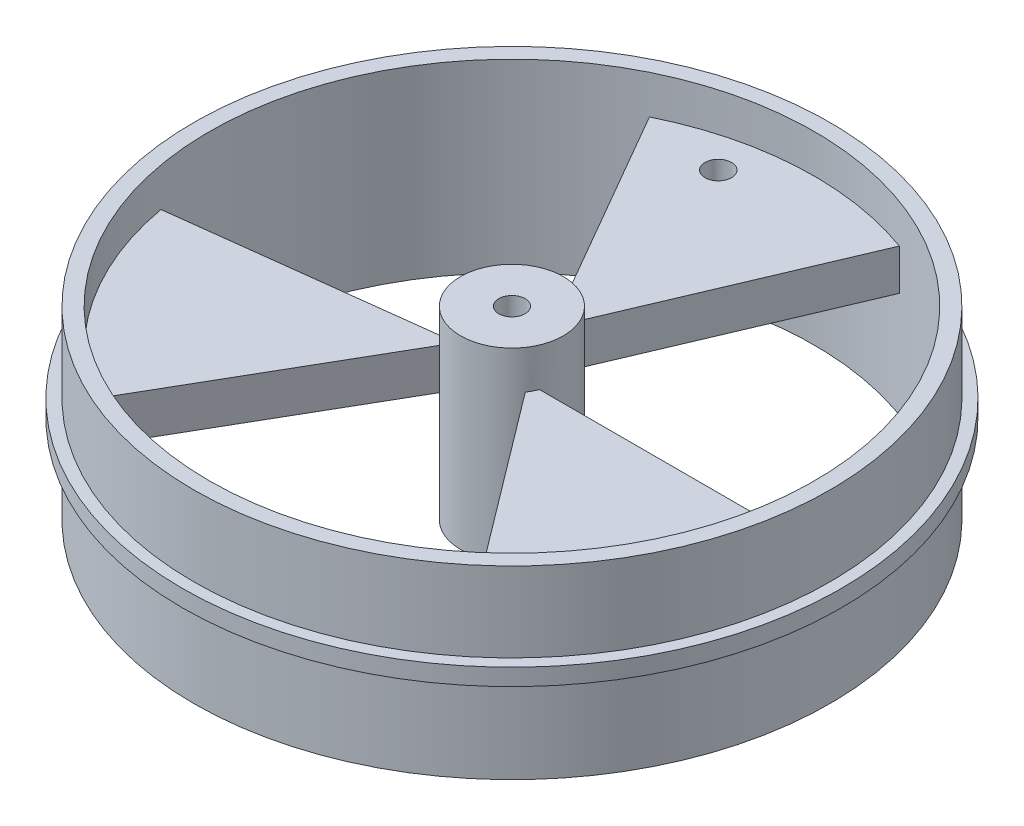
ISO-10303-21;
HEADER;
FILE_DESCRIPTION(('STEP AP214'),'2;1');
FILE_NAME('part.step','',(''),(''),'','','');
FILE_SCHEMA(('AUTOMOTIVE_DESIGN { 1 0 10303 214 1 1 1 1 }'));
ENDSEC;
DATA;
#1=APPLICATION_CONTEXT('core data for automotive mechanical design processes');
#2=APPLICATION_PROTOCOL_DEFINITION('international standard','automotive_design',2000,#1);
#3=PRODUCT_CONTEXT('',#1,'mechanical');
#4=PRODUCT('Part','Part','',(#3));
#5=PRODUCT_RELATED_PRODUCT_CATEGORY('part','',(#4));
#6=PRODUCT_DEFINITION_FORMATION('','',#4);
#7=PRODUCT_DEFINITION_CONTEXT('part definition',#1,'design');
#8=PRODUCT_DEFINITION('design','',#6,#7);
#9=PRODUCT_DEFINITION_SHAPE('','',#8);
#10=(LENGTH_UNIT() NAMED_UNIT(*) SI_UNIT(.MILLI.,.METRE.));
#11=(NAMED_UNIT(*) PLANE_ANGLE_UNIT() SI_UNIT($,.RADIAN.));
#12=(NAMED_UNIT(*) SI_UNIT($,.STERADIAN.) SOLID_ANGLE_UNIT());
#13=UNCERTAINTY_MEASURE_WITH_UNIT(LENGTH_MEASURE(1.E-05),#10,'distance_accuracy_value','');
#14=(GEOMETRIC_REPRESENTATION_CONTEXT(3) GLOBAL_UNCERTAINTY_ASSIGNED_CONTEXT((#13)) GLOBAL_UNIT_ASSIGNED_CONTEXT((#10,
#11,#12)) REPRESENTATION_CONTEXT('',''));
#15=CARTESIAN_POINT('',(0.,0.,0.));
#16=DIRECTION('',(0.,0.,1.));
#17=DIRECTION('',(1.,0.,0.));
#18=AXIS2_PLACEMENT_3D('',#15,#16,#17);
#19=CARTESIAN_POINT('',(0.,6.57965987243205,0.));
#20=DIRECTION('',(0.,1.,0.));
#21=DIRECTION('',(0.,0.,1.));
#22=AXIS2_PLACEMENT_3D('',#19,#20,#21);
#23=CYLINDRICAL_SURFACE('',#22,14.49);
#24=DIRECTION('',(0.,1.,0.));
#25=VECTOR('',#24,1.);
#26=CARTESIAN_POINT('',(4.93043286261788,6.57965987243205,-13.6253782254739));
#27=LINE('',#26,#25);
#28=CARTESIAN_POINT('',(4.93043286261788,0.,-13.6253782254739));
#29=VERTEX_POINT('',#28);
#30=CARTESIAN_POINT('',(4.93043286261788,1.96148714375324,-13.6253782254739));
#31=VERTEX_POINT('',#30);
#32=EDGE_CURVE('E184',#29,#31,#27,.T.);
#33=ORIENTED_EDGE('',*,*,#32,.F.);
#34=CARTESIAN_POINT('',(0.,0.,0.));
#35=DIRECTION('',(0.,1.,0.));
#36=DIRECTION('',(0.,0.,1.));
#37=AXIS2_PLACEMENT_3D('',#34,#35,#36);
#38=CIRCLE('',#37,14.49);
#39=CARTESIAN_POINT('',(-6.41011764680214,0.,-12.9950179589778));
#40=VERTEX_POINT('',#39);
#41=EDGE_CURVE('E191',#40,#29,#38,.F.);
#42=ORIENTED_EDGE('',*,*,#41,.F.);
#43=DIRECTION('',(0.,1.,0.));
#44=VECTOR('',#43,1.);
#45=CARTESIAN_POINT('',(-6.41011764680214,6.57965987243205,-12.9950179589778));
#46=LINE('',#45,#44);
#47=CARTESIAN_POINT('',(-6.41011764680214,1.96148714375324,-12.9950179589778));
#48=VERTEX_POINT('',#47);
#49=EDGE_CURVE('E180',#40,#48,#46,.T.);
#50=ORIENTED_EDGE('',*,*,#49,.T.);
#51=CARTESIAN_POINT('',(0.,1.96148714375324,0.));
#52=DIRECTION('',(0.,-1.,0.));
#53=DIRECTION('',(0.,0.,-1.));
#54=AXIS2_PLACEMENT_3D('',#51,#52,#53);
#55=CIRCLE('',#54,14.49);
#56=EDGE_CURVE('E187',#31,#48,#55,.F.);
#57=ORIENTED_EDGE('',*,*,#56,.F.);
#58=EDGE_LOOP('',(#33,#42,#50,#57));
#59=FACE_BOUND('',#58,.T.);
#60=CARTESIAN_POINT('',(0.,3.81388504044521,0.));
#61=DIRECTION('',(0.,1.,0.));
#62=DIRECTION('',(0.,0.,1.));
#63=AXIS2_PLACEMENT_3D('',#60,#61,#62);
#64=CIRCLE('',#63,14.49);
#65=CARTESIAN_POINT('',(0.,3.81388504044521,14.49));
#66=VERTEX_POINT('',#65);
#67=EDGE_CURVE('E272',#66,#66,#64,.T.);
#68=ORIENTED_EDGE('',*,*,#67,.T.);
#69=EDGE_LOOP('',(#68));
#70=FACE_BOUND('',#69,.T.);
#71=CARTESIAN_POINT('',(0.,-5.04947785274883,0.));
#72=DIRECTION('',(0.,1.,0.));
#73=DIRECTION('',(0.,0.,1.));
#74=AXIS2_PLACEMENT_3D('',#71,#72,#73);
#75=CIRCLE('',#74,14.49);
#76=CARTESIAN_POINT('',(0.,-5.04947785274883,14.49));
#77=VERTEX_POINT('',#76);
#78=EDGE_CURVE('E276',#77,#77,#75,.T.);
#79=ORIENTED_EDGE('',*,*,#78,.F.);
#80=EDGE_LOOP('',(#79));
#81=FACE_BOUND('',#80,.T.);
#82=CARTESIAN_POINT('',(0.,0.,0.));
#83=DIRECTION('',(0.,1.,0.));
#84=DIRECTION('',(0.,0.,1.));
#85=AXIS2_PLACEMENT_3D('',#82,#83,#84);
#86=CIRCLE('',#85,14.49);
#87=CARTESIAN_POINT('',(14.49,0.,0.));
#88=VERTEX_POINT('',#87);
#89=CARTESIAN_POINT('',(9.33470724812272,0.,11.0825692234177));
#90=VERTEX_POINT('',#89);
#91=EDGE_CURVE('E288',#88,#90,#86,.F.);
#92=ORIENTED_EDGE('',*,*,#91,.F.);
#93=CARTESIAN_POINT('',(0.,0.,0.));
#94=DIRECTION('',(0.,0.434473259704055,-0.900684732080062));
#95=DIRECTION('',(0.,0.900684732080062,0.434473259704055));
#96=AXIS2_PLACEMENT_3D('',#93,#94,#95);
#97=ELLIPSE('',#96,33.3507291331807,14.49);
#98=CARTESIAN_POINT('',(14.4590744985109,1.96148714375324,0.946184256111396));
#99=VERTEX_POINT('',#98);
#100=EDGE_CURVE('E229',#88,#99,#97,.F.);
#101=ORIENTED_EDGE('',*,*,#100,.T.);
#102=CARTESIAN_POINT('',(0.,1.96148714375324,0.));
#103=DIRECTION('',(0.,-1.,0.));
#104=DIRECTION('',(0.,0.,-1.));
#105=AXIS2_PLACEMENT_3D('',#102,#103,#104);
#106=CIRCLE('',#105,14.49);
#107=CARTESIAN_POINT('',(9.33470724812272,1.96148714375324,11.0825692234177));
#108=VERTEX_POINT('',#107);
#109=EDGE_CURVE('E284',#108,#99,#106,.F.);
#110=ORIENTED_EDGE('',*,*,#109,.F.);
#111=DIRECTION('',(0.,1.,0.));
#112=VECTOR('',#111,1.);
#113=CARTESIAN_POINT('',(9.33470724812272,6.57965987243205,11.0825692234177));
#114=LINE('',#113,#112);
#115=EDGE_CURVE('E292',#90,#108,#114,.T.);
#116=ORIENTED_EDGE('',*,*,#115,.F.);
#117=EDGE_LOOP('',(#92,#101,#110,#116));
#118=FACE_BOUND('',#117,.T.);
#119=DIRECTION('',(0.,1.,0.));
#120=VECTOR('',#119,1.);
#121=CARTESIAN_POINT('',(-14.2651401107406,6.57965987243205,2.54280900205629));
#122=LINE('',#121,#120);
#123=CARTESIAN_POINT('',(-14.2651401107406,0.,2.54280900205629));
#124=VERTEX_POINT('',#123);
#125=CARTESIAN_POINT('',(-14.2651401107406,1.96148714375324,2.54280900205629));
#126=VERTEX_POINT('',#125);
#127=EDGE_CURVE('E145',#124,#126,#122,.T.);
#128=ORIENTED_EDGE('',*,*,#127,.F.);
#129=CARTESIAN_POINT('',(0.,0.,0.));
#130=DIRECTION('',(0.,1.,0.));
#131=DIRECTION('',(0.,0.,1.));
#132=AXIS2_PLACEMENT_3D('',#129,#130,#131);
#133=CIRCLE('',#132,14.49);
#134=CARTESIAN_POINT('',(-8.04895685170866,0.,12.0488337028665));
#135=VERTEX_POINT('',#134);
#136=EDGE_CURVE('E151',#135,#124,#133,.F.);
#137=ORIENTED_EDGE('',*,*,#136,.F.);
#138=DIRECTION('',(0.,1.,0.));
#139=VECTOR('',#138,1.);
#140=CARTESIAN_POINT('',(-8.04895685170866,6.57965987243205,12.0488337028665));
#141=LINE('',#140,#139);
#142=CARTESIAN_POINT('',(-8.04895685170866,1.96148714375324,12.0488337028665));
#143=VERTEX_POINT('',#142);
#144=EDGE_CURVE('E137',#135,#143,#141,.T.);
#145=ORIENTED_EDGE('',*,*,#144,.T.);
#146=CARTESIAN_POINT('',(0.,1.96148714375324,0.));
#147=DIRECTION('',(0.,-1.,0.));
#148=DIRECTION('',(0.,0.,-1.));
#149=AXIS2_PLACEMENT_3D('',#146,#147,#148);
#150=CIRCLE('',#149,14.49);
#151=EDGE_CURVE('E159',#126,#143,#150,.F.);
#152=ORIENTED_EDGE('',*,*,#151,.F.);
#153=EDGE_LOOP('',(#128,#137,#145,#152));
#154=FACE_BOUND('',#153,.T.);
#155=ADVANCED_FACE('F49',(#59,#70,#81,#118,#154),#23,.F.);
#156=CARTESIAN_POINT('',(0.,6.57965987243205,0.));
#157=DIRECTION('',(0.,1.,0.));
#158=DIRECTION('',(0.,0.,1.));
#159=AXIS2_PLACEMENT_3D('',#156,#157,#158);
#160=CYLINDRICAL_SURFACE('',#159,2.45972344573901);
#161=CARTESIAN_POINT('',(0.,3.81388504044521,0.));
#162=DIRECTION('',(0.,1.,0.));
#163=DIRECTION('',(0.,0.,1.));
#164=AXIS2_PLACEMENT_3D('',#161,#162,#163);
#165=CIRCLE('',#164,2.45972344573901);
#166=CARTESIAN_POINT('',(0.,3.81388504044521,2.45972344573901));
#167=VERTEX_POINT('',#166);
#168=EDGE_CURVE('E209',#167,#167,#165,.T.);
#169=ORIENTED_EDGE('',*,*,#168,.F.);
#170=EDGE_LOOP('',(#169));
#171=FACE_BOUND('',#170,.T.);
#172=CARTESIAN_POINT('',(0.,-5.04947785274883,0.));
#173=DIRECTION('',(0.,1.,0.));
#174=DIRECTION('',(0.,0.,1.));
#175=AXIS2_PLACEMENT_3D('',#172,#173,#174);
#176=CIRCLE('',#175,2.45972344573901);
#177=CARTESIAN_POINT('',(0.,-5.04947785274883,2.45972344573901));
#178=VERTEX_POINT('',#177);
#179=EDGE_CURVE('E205',#178,#178,#176,.T.);
#180=ORIENTED_EDGE('',*,*,#179,.T.);
#181=EDGE_LOOP('',(#180));
#182=FACE_BOUND('',#181,.T.);
#183=CARTESIAN_POINT('',(0.,0.,0.));
#184=DIRECTION('',(0.,-1.,0.));
#185=DIRECTION('',(0.,0.,-1.));
#186=AXIS2_PLACEMENT_3D('',#183,#184,#185);
#187=CIRCLE('',#186,2.45972344573901);
#188=CARTESIAN_POINT('',(2.03003992652024,0.,1.38894828062526));
#189=VERTEX_POINT('',#188);
#190=CARTESIAN_POINT('',(2.45972344573901,0.,0.));
#191=VERTEX_POINT('',#190);
#192=EDGE_CURVE('E221',#189,#191,#187,.F.);
#193=ORIENTED_EDGE('',*,*,#192,.F.);
#194=DIRECTION('',(0.,1.,0.));
#195=VECTOR('',#194,1.);
#196=CARTESIAN_POINT('',(2.03003992652024,6.57965987243205,1.38894828062526));
#197=LINE('',#196,#195);
#198=CARTESIAN_POINT('',(2.03003992652024,1.96148714375324,1.38894828062526));
#199=VERTEX_POINT('',#198);
#200=EDGE_CURVE('E233',#199,#189,#197,.F.);
#201=ORIENTED_EDGE('',*,*,#200,.F.);
#202=CARTESIAN_POINT('',(0.,1.96148714375324,0.));
#203=DIRECTION('',(0.,-1.,0.));
#204=DIRECTION('',(0.,0.,-1.));
#205=AXIS2_PLACEMENT_3D('',#202,#203,#204);
#206=CIRCLE('',#205,2.45972344573901);
#207=CARTESIAN_POINT('',(2.27045695466906,1.96148714375324,0.946184256111396));
#208=VERTEX_POINT('',#207);
#209=EDGE_CURVE('E237',#208,#199,#206,.T.);
#210=ORIENTED_EDGE('',*,*,#209,.F.);
#211=CARTESIAN_POINT('',(0.,0.,0.));
#212=DIRECTION('',(0.,0.434473259704055,-0.900684732080062));
#213=DIRECTION('',(0.,0.900684732080062,0.434473259704055));
#214=AXIS2_PLACEMENT_3D('',#211,#212,#213);
#215=ELLIPSE('',#214,5.66139202079886,2.45972344573901);
#216=EDGE_CURVE('E225',#191,#208,#215,.F.);
#217=ORIENTED_EDGE('',*,*,#216,.F.);
#218=EDGE_LOOP('',(#193,#201,#210,#217));
#219=FACE_BOUND('',#218,.T.);
#220=CARTESIAN_POINT('',(0.,0.,0.));
#221=DIRECTION('',(0.,1.,0.));
#222=DIRECTION('',(0.,0.,1.));
#223=AXIS2_PLACEMENT_3D('',#220,#221,#222);
#224=CIRCLE('',#223,2.45972344573901);
#225=CARTESIAN_POINT('',(-0.315808874881191,0.,-2.43936552899816));
#226=VERTEX_POINT('',#225);
#227=CARTESIAN_POINT('',(0.187844532304064,0.,-2.45254028737586));
#228=VERTEX_POINT('',#227);
#229=EDGE_CURVE('E302',#226,#228,#224,.F.);
#230=ORIENTED_EDGE('',*,*,#229,.T.);
#231=DIRECTION('',(0.,1.,0.));
#232=VECTOR('',#231,1.);
#233=CARTESIAN_POINT('',(0.187844532304066,6.57965987243205,-2.45254028737586));
#234=LINE('',#233,#232);
#235=CARTESIAN_POINT('',(0.187844532304066,1.96148714375324,-2.45254028737586));
#236=VERTEX_POINT('',#235);
#237=EDGE_CURVE('E305',#228,#236,#234,.T.);
#238=ORIENTED_EDGE('',*,*,#237,.T.);
#239=CARTESIAN_POINT('',(0.,1.96148714375324,0.));
#240=DIRECTION('',(0.,-1.,0.));
#241=DIRECTION('',(0.,0.,-1.));
#242=AXIS2_PLACEMENT_3D('',#239,#240,#241);
#243=CIRCLE('',#242,2.45972344573901);
#244=CARTESIAN_POINT('',(-0.315808874881191,1.96148714375324,-2.43936552899816));
#245=VERTEX_POINT('',#244);
#246=EDGE_CURVE('E299',#236,#245,#243,.F.);
#247=ORIENTED_EDGE('',*,*,#246,.T.);
#248=DIRECTION('',(0.,1.,0.));
#249=VECTOR('',#248,1.);
#250=CARTESIAN_POINT('',(-0.315808874881191,6.57965987243205,-2.43936552899816));
#251=LINE('',#250,#249);
#252=EDGE_CURVE('E295',#226,#245,#251,.T.);
#253=ORIENTED_EDGE('',*,*,#252,.F.);
#254=EDGE_LOOP('',(#230,#238,#247,#253));
#255=FACE_BOUND('',#254,.T.);
#256=CARTESIAN_POINT('',(0.,0.,0.));
#257=DIRECTION('',(0.,1.,0.));
#258=DIRECTION('',(0.,0.,1.));
#259=AXIS2_PLACEMENT_3D('',#256,#257,#258);
#260=CIRCLE('',#259,2.45972344573901);
#261=CARTESIAN_POINT('',(-1.95464807978787,0.,1.49318127288678));
#262=VERTEX_POINT('',#261);
#263=CARTESIAN_POINT('',(-2.21788445882431,0.,1.06359200675061));
#264=VERTEX_POINT('',#263);
#265=EDGE_CURVE('E58',#262,#264,#260,.F.);
#266=ORIENTED_EDGE('',*,*,#265,.T.);
#267=DIRECTION('',(0.,1.,0.));
#268=VECTOR('',#267,1.);
#269=CARTESIAN_POINT('',(-2.21788445882431,6.57965987243205,1.06359200675061));
#270=LINE('',#269,#268);
#271=CARTESIAN_POINT('',(-2.21788445882431,1.96148714375324,1.06359200675061));
#272=VERTEX_POINT('',#271);
#273=EDGE_CURVE('E11',#264,#272,#270,.T.);
#274=ORIENTED_EDGE('',*,*,#273,.T.);
#275=CARTESIAN_POINT('',(0.,1.96148714375324,0.));
#276=DIRECTION('',(0.,-1.,0.));
#277=DIRECTION('',(0.,0.,-1.));
#278=AXIS2_PLACEMENT_3D('',#275,#276,#277);
#279=CIRCLE('',#278,2.45972344573901);
#280=CARTESIAN_POINT('',(-1.95464807978787,1.96148714375324,1.49318127288678));
#281=VERTEX_POINT('',#280);
#282=EDGE_CURVE('E311',#272,#281,#279,.F.);
#283=ORIENTED_EDGE('',*,*,#282,.T.);
#284=DIRECTION('',(0.,1.,0.));
#285=VECTOR('',#284,1.);
#286=CARTESIAN_POINT('',(-1.95464807978787,6.57965987243205,1.49318127288678));
#287=LINE('',#286,#285);
#288=EDGE_CURVE('E308',#262,#281,#287,.T.);
#289=ORIENTED_EDGE('',*,*,#288,.F.);
#290=EDGE_LOOP('',(#266,#274,#283,#289));
#291=FACE_BOUND('',#290,.T.);
#292=ADVANCED_FACE('F315',(#171,#182,#219,#255,#291),#160,.T.);
#293=CARTESIAN_POINT('',(0.,6.57965987243205,0.));
#294=DIRECTION('',(0.,1.,0.));
#295=DIRECTION('',(0.,0.,1.));
#296=AXIS2_PLACEMENT_3D('',#293,#294,#295);
#297=CYLINDRICAL_SURFACE('',#296,15.24);
#298=CARTESIAN_POINT('',(0.,-0.805733209137354,0.));
#299=DIRECTION('',(0.,1.,0.));
#300=DIRECTION('',(0.,0.,1.));
#301=AXIS2_PLACEMENT_3D('',#298,#299,#300);
#302=CIRCLE('',#301,15.24);
#303=CARTESIAN_POINT('',(0.,-0.805733209137354,15.24));
#304=VERTEX_POINT('',#303);
#305=EDGE_CURVE('E252',#304,#304,#302,.T.);
#306=ORIENTED_EDGE('',*,*,#305,.F.);
#307=EDGE_LOOP('',(#306));
#308=FACE_BOUND('',#307,.T.);
#309=CARTESIAN_POINT('',(0.,-5.04947785274883,0.));
#310=DIRECTION('',(0.,1.,0.));
#311=DIRECTION('',(0.,0.,1.));
#312=AXIS2_PLACEMENT_3D('',#309,#310,#311);
#313=CIRCLE('',#312,15.24);
#314=CARTESIAN_POINT('',(0.,-5.04947785274883,15.24));
#315=VERTEX_POINT('',#314);
#316=EDGE_CURVE('E280',#315,#315,#313,.T.);
#317=ORIENTED_EDGE('',*,*,#316,.T.);
#318=EDGE_LOOP('',(#317));
#319=FACE_BOUND('',#318,.T.);
#320=ADVANCED_FACE('F51',(#308,#319),#297,.T.);
#321=CARTESIAN_POINT('',(0.,-5.04947785274883,0.));
#322=DIRECTION('',(0.,1.,0.));
#323=DIRECTION('',(0.,0.,1.));
#324=AXIS2_PLACEMENT_3D('',#321,#322,#323);
#325=PLANE('',#324);
#326=ORIENTED_EDGE('',*,*,#316,.F.);
#327=EDGE_LOOP('',(#326));
#328=FACE_BOUND('',#327,.T.);
#329=ORIENTED_EDGE('',*,*,#78,.T.);
#330=EDGE_LOOP('',(#329));
#331=FACE_BOUND('',#330,.T.);
#332=ADVANCED_FACE('F354',(#328,#331),#325,.F.);
#333=CARTESIAN_POINT('',(0.,3.81388504044521,0.));
#334=DIRECTION('',(0.,1.,0.));
#335=DIRECTION('',(0.,0.,1.));
#336=AXIS2_PLACEMENT_3D('',#333,#334,#335);
#337=PLANE('',#336);
#338=CARTESIAN_POINT('',(0.,3.81388504044521,0.));
#339=DIRECTION('',(0.,1.,0.));
#340=DIRECTION('',(0.,0.,1.));
#341=AXIS2_PLACEMENT_3D('',#338,#339,#340);
#342=CIRCLE('',#341,15.24);
#343=CARTESIAN_POINT('',(0.,3.81388504044521,15.24));
#344=VERTEX_POINT('',#343);
#345=EDGE_CURVE('E268',#344,#344,#342,.T.);
#346=ORIENTED_EDGE('',*,*,#345,.T.);
#347=EDGE_LOOP('',(#346));
#348=FACE_BOUND('',#347,.T.);
#349=ORIENTED_EDGE('',*,*,#67,.F.);
#350=EDGE_LOOP('',(#349));
#351=FACE_BOUND('',#350,.T.);
#352=ADVANCED_FACE('F352',(#348,#351),#337,.T.);
#353=CARTESIAN_POINT('',(0.,6.57965987243205,0.));
#354=DIRECTION('',(0.,1.,0.));
#355=DIRECTION('',(0.,0.,1.));
#356=AXIS2_PLACEMENT_3D('',#353,#354,#355);
#357=CYLINDRICAL_SURFACE('',#356,15.24);
#358=CARTESIAN_POINT('',(0.,0.,0.));
#359=DIRECTION('',(0.,1.,0.));
#360=DIRECTION('',(0.,0.,1.));
#361=AXIS2_PLACEMENT_3D('',#358,#359,#360);
#362=CIRCLE('',#361,15.24);
#363=CARTESIAN_POINT('',(0.,0.,15.24));
#364=VERTEX_POINT('',#363);
#365=EDGE_CURVE('E264',#364,#364,#362,.T.);
#366=ORIENTED_EDGE('',*,*,#365,.T.);
#367=EDGE_LOOP('',(#366));
#368=FACE_BOUND('',#367,.T.);
#369=ORIENTED_EDGE('',*,*,#345,.F.);
#370=EDGE_LOOP('',(#369));
#371=FACE_BOUND('',#370,.T.);
#372=ADVANCED_FACE('F361',(#368,#371),#357,.T.);
#373=CARTESIAN_POINT('',(0.,0.,0.));
#374=DIRECTION('',(0.,1.,0.));
#375=DIRECTION('',(0.,0.,1.));
#376=AXIS2_PLACEMENT_3D('',#373,#374,#375);
#377=PLANE('',#376);
#378=CARTESIAN_POINT('',(0.,0.,0.));
#379=DIRECTION('',(0.,1.,0.));
#380=DIRECTION('',(0.,0.,1.));
#381=AXIS2_PLACEMENT_3D('',#378,#379,#380);
#382=CIRCLE('',#381,15.7847494286564);
#383=CARTESIAN_POINT('',(0.,0.,15.7847494286564));
#384=VERTEX_POINT('',#383);
#385=EDGE_CURVE('E260',#384,#384,#382,.T.);
#386=ORIENTED_EDGE('',*,*,#385,.T.);
#387=EDGE_LOOP('',(#386));
#388=FACE_BOUND('',#387,.T.);
#389=ORIENTED_EDGE('',*,*,#365,.F.);
#390=EDGE_LOOP('',(#389));
#391=FACE_BOUND('',#390,.T.);
#392=ADVANCED_FACE('F402',(#388,#391),#377,.T.);
#393=CARTESIAN_POINT('',(0.,6.57965987243205,0.));
#394=DIRECTION('',(0.,1.,0.));
#395=DIRECTION('',(0.,0.,1.));
#396=AXIS2_PLACEMENT_3D('',#393,#394,#395);
#397=CYLINDRICAL_SURFACE('',#396,15.7847494286564);
#398=CARTESIAN_POINT('',(0.,-0.805733209137354,0.));
#399=DIRECTION('',(0.,1.,0.));
#400=DIRECTION('',(0.,0.,1.));
#401=AXIS2_PLACEMENT_3D('',#398,#399,#400);
#402=CIRCLE('',#401,15.7847494286564);
#403=CARTESIAN_POINT('',(0.,-0.805733209137354,15.7847494286564));
#404=VERTEX_POINT('',#403);
#405=EDGE_CURVE('E256',#404,#404,#402,.T.);
#406=ORIENTED_EDGE('',*,*,#405,.T.);
#407=EDGE_LOOP('',(#406));
#408=FACE_BOUND('',#407,.T.);
#409=ORIENTED_EDGE('',*,*,#385,.F.);
#410=EDGE_LOOP('',(#409));
#411=FACE_BOUND('',#410,.T.);
#412=ADVANCED_FACE('F398',(#408,#411),#397,.T.);
#413=CARTESIAN_POINT('',(0.,-0.805733209137354,0.));
#414=DIRECTION('',(0.,-1.,0.));
#415=DIRECTION('',(0.,0.,-1.));
#416=AXIS2_PLACEMENT_3D('',#413,#414,#415);
#417=PLANE('',#416);
#418=ORIENTED_EDGE('',*,*,#305,.T.);
#419=EDGE_LOOP('',(#418));
#420=FACE_BOUND('',#419,.T.);
#421=ORIENTED_EDGE('',*,*,#405,.F.);
#422=EDGE_LOOP('',(#421));
#423=FACE_BOUND('',#422,.T.);
#424=ADVANCED_FACE('F393',(#420,#423),#417,.T.);
#425=CARTESIAN_POINT('',(9.59335249459646,0.,11.4258030583874));
#426=DIRECTION('',(0.,1.,0.));
#427=DIRECTION('',(0.,0.,1.));
#428=AXIS2_PLACEMENT_3D('',#425,#426,#427);
#429=PLANE('',#428);
#430=DIRECTION('',(0.601815023152047,0.,0.798635510047294));
#431=VECTOR('',#430,1.);
#432=CARTESIAN_POINT('',(9.59335249459646,0.,11.4258030583874));
#433=LINE('',#432,#431);
#434=EDGE_CURVE('E245',#189,#90,#433,.T.);
#435=ORIENTED_EDGE('',*,*,#434,.F.);
#436=ORIENTED_EDGE('',*,*,#192,.T.);
#437=DIRECTION('',(-1.,0.,0.));
#438=VECTOR('',#437,1.);
#439=CARTESIAN_POINT('',(14.6049,0.,0.));
#440=LINE('',#439,#438);
#441=EDGE_CURVE('E194',#88,#191,#440,.T.);
#442=ORIENTED_EDGE('',*,*,#441,.F.);
#443=ORIENTED_EDGE('',*,*,#91,.T.);
#444=EDGE_LOOP('',(#435,#436,#442,#443));
#445=FACE_BOUND('',#444,.T.);
#446=ADVANCED_FACE('F378',(#445),#429,.F.);
#447=CARTESIAN_POINT('',(1.696393302608,1.96148714375324,0.946184256111396));
#448=DIRECTION('',(0.,-1.,0.));
#449=DIRECTION('',(0.,0.,-1.));
#450=AXIS2_PLACEMENT_3D('',#447,#448,#449);
#451=PLANE('',#450);
#452=DIRECTION('',(-1.,0.,0.));
#453=VECTOR('',#452,1.);
#454=CARTESIAN_POINT('',(1.696393302608,1.96148714375324,0.946184256111396));
#455=LINE('',#454,#453);
#456=EDGE_CURVE('E241',#99,#208,#455,.T.);
#457=ORIENTED_EDGE('',*,*,#456,.T.);
#458=ORIENTED_EDGE('',*,*,#209,.T.);
#459=DIRECTION('',(-0.601815023152047,0.,-0.798635510047294));
#460=VECTOR('',#459,1.);
#461=CARTESIAN_POINT('',(1.696393302608,1.96148714375324,0.946184256111396));
#462=LINE('',#461,#460);
#463=EDGE_CURVE('E248',#108,#199,#462,.T.);
#464=ORIENTED_EDGE('',*,*,#463,.F.);
#465=ORIENTED_EDGE('',*,*,#109,.T.);
#466=EDGE_LOOP('',(#457,#458,#464,#465));
#467=FACE_BOUND('',#466,.T.);
#468=ADVANCED_FACE('F385',(#467),#451,.F.);
#469=CARTESIAN_POINT('',(0.675478327923989,0.,-0.408615674357758));
#470=DIRECTION('',(0.798635510047294,0.,-0.601815023152047));
#471=DIRECTION('',(-0.601815023152047,0.,-0.798635510047294));
#472=AXIS2_PLACEMENT_3D('',#469,#470,#471);
#473=PLANE('',#472);
#474=ORIENTED_EDGE('',*,*,#463,.T.);
#475=ORIENTED_EDGE('',*,*,#200,.T.);
#476=ORIENTED_EDGE('',*,*,#434,.T.);
#477=ORIENTED_EDGE('',*,*,#115,.T.);
#478=EDGE_LOOP('',(#474,#475,#476,#477));
#479=FACE_BOUND('',#478,.T.);
#480=ADVANCED_FACE('F382',(#479),#473,.F.);
#481=CARTESIAN_POINT('',(14.6049,0.,0.));
#482=DIRECTION('',(0.,0.434473259704055,-0.900684732080062));
#483=DIRECTION('',(0.,0.900684732080062,0.434473259704055));
#484=AXIS2_PLACEMENT_3D('',#481,#482,#483);
#485=PLANE('',#484);
#486=ORIENTED_EDGE('',*,*,#100,.F.);
#487=ORIENTED_EDGE('',*,*,#441,.T.);
#488=ORIENTED_EDGE('',*,*,#216,.T.);
#489=ORIENTED_EDGE('',*,*,#456,.F.);
#490=EDGE_LOOP('',(#486,#487,#488,#489));
#491=FACE_BOUND('',#490,.T.);
#492=ADVANCED_FACE('F376',(#491),#485,.T.);
#493=CARTESIAN_POINT('',(0.,2.81765826799531,0.));
#494=DIRECTION('',(0.,1.,0.));
#495=DIRECTION('',(0.,0.,1.));
#496=AXIS2_PLACEMENT_3D('',#493,#494,#495);
#497=PLANE('',#496);
#498=CARTESIAN_POINT('',(0.,2.81765826799531,0.));
#499=DIRECTION('',(0.,1.,0.));
#500=DIRECTION('',(0.,0.,1.));
#501=AXIS2_PLACEMENT_3D('',#498,#499,#500);
#502=CIRCLE('',#501,1.66187698324019);
#503=CARTESIAN_POINT('',(0.,2.81765826799531,1.66187698324019));
#504=VERTEX_POINT('',#503);
#505=EDGE_CURVE('E197',#504,#504,#502,.T.);
#506=ORIENTED_EDGE('',*,*,#505,.F.);
#507=EDGE_LOOP('',(#506));
#508=FACE_BOUND('',#507,.T.);
#509=CARTESIAN_POINT('',(0.,2.81765826799531,0.));
#510=DIRECTION('',(0.,1.,0.));
#511=DIRECTION('',(0.,0.,1.));
#512=AXIS2_PLACEMENT_3D('',#509,#510,#511);
#513=CIRCLE('',#512,0.629369796477006);
#514=CARTESIAN_POINT('',(0.,2.81765826799531,0.629369796477006));
#515=VERTEX_POINT('',#514);
#516=EDGE_CURVE('E217',#515,#515,#513,.T.);
#517=ORIENTED_EDGE('',*,*,#516,.T.);
#518=EDGE_LOOP('',(#517));
#519=FACE_BOUND('',#518,.T.);
#520=ADVANCED_FACE('F523',(#508,#519),#497,.F.);
#521=CARTESIAN_POINT('',(0.,6.57965987243205,0.));
#522=DIRECTION('',(0.,1.,0.));
#523=DIRECTION('',(0.,0.,1.));
#524=AXIS2_PLACEMENT_3D('',#521,#522,#523);
#525=CYLINDRICAL_SURFACE('',#524,0.629369796477006);
#526=ORIENTED_EDGE('',*,*,#516,.F.);
#527=EDGE_LOOP('',(#526));
#528=FACE_BOUND('',#527,.T.);
#529=CARTESIAN_POINT('',(0.,3.81388504044521,0.));
#530=DIRECTION('',(0.,1.,0.));
#531=DIRECTION('',(0.,0.,1.));
#532=AXIS2_PLACEMENT_3D('',#529,#530,#531);
#533=CIRCLE('',#532,0.629369796477006);
#534=CARTESIAN_POINT('',(0.,3.81388504044521,0.629369796477006));
#535=VERTEX_POINT('',#534);
#536=EDGE_CURVE('E213',#535,#535,#533,.T.);
#537=ORIENTED_EDGE('',*,*,#536,.T.);
#538=EDGE_LOOP('',(#537));
#539=FACE_BOUND('',#538,.T.);
#540=ADVANCED_FACE('F528',(#528,#539),#525,.F.);
#541=CARTESIAN_POINT('',(0.,3.81388504044521,0.));
#542=DIRECTION('',(0.,-1.,0.));
#543=DIRECTION('',(0.,0.,-1.));
#544=AXIS2_PLACEMENT_3D('',#541,#542,#543);
#545=PLANE('',#544);
#546=ORIENTED_EDGE('',*,*,#536,.F.);
#547=EDGE_LOOP('',(#546));
#548=FACE_BOUND('',#547,.T.);
#549=ORIENTED_EDGE('',*,*,#168,.T.);
#550=EDGE_LOOP('',(#549));
#551=FACE_BOUND('',#550,.T.);
#552=ADVANCED_FACE('F538',(#548,#551),#545,.F.);
#553=CARTESIAN_POINT('',(0.,-5.04947785274883,0.));
#554=DIRECTION('',(0.,-1.,0.));
#555=DIRECTION('',(0.,0.,-1.));
#556=AXIS2_PLACEMENT_3D('',#553,#554,#555);
#557=PLANE('',#556);
#558=CARTESIAN_POINT('',(0.,-5.04947785274883,0.));
#559=DIRECTION('',(0.,1.,0.));
#560=DIRECTION('',(0.,0.,1.));
#561=AXIS2_PLACEMENT_3D('',#558,#559,#560);
#562=CIRCLE('',#561,1.66187698324019);
#563=CARTESIAN_POINT('',(0.,-5.04947785274883,1.66187698324019));
#564=VERTEX_POINT('',#563);
#565=EDGE_CURVE('E201',#564,#564,#562,.T.);
#566=ORIENTED_EDGE('',*,*,#565,.T.);
#567=EDGE_LOOP('',(#566));
#568=FACE_BOUND('',#567,.T.);
#569=ORIENTED_EDGE('',*,*,#179,.F.);
#570=EDGE_LOOP('',(#569));
#571=FACE_BOUND('',#570,.T.);
#572=ADVANCED_FACE('F548',(#568,#571),#557,.T.);
#573=CARTESIAN_POINT('',(0.,6.57965987243205,0.));
#574=DIRECTION('',(0.,1.,0.));
#575=DIRECTION('',(0.,0.,1.));
#576=AXIS2_PLACEMENT_3D('',#573,#574,#575);
#577=CYLINDRICAL_SURFACE('',#576,1.66187698324019);
#578=ORIENTED_EDGE('',*,*,#505,.T.);
#579=EDGE_LOOP('',(#578));
#580=FACE_BOUND('',#579,.T.);
#581=ORIENTED_EDGE('',*,*,#565,.F.);
#582=EDGE_LOOP('',(#581));
#583=FACE_BOUND('',#582,.T.);
#584=ADVANCED_FACE('F499',(#580,#583),#577,.F.);
#585=CARTESIAN_POINT('',(5.09835945990313,0.,-14.0209884969731));
#586=DIRECTION('',(0.,1.,0.));
#587=DIRECTION('',(0.866025403784436,0.,-0.500000000000004));
#588=AXIS2_PLACEMENT_3D('',#585,#586,#587);
#589=PLANE('',#588);
#590=CARTESIAN_POINT('',(-2.55736197731466,0.,-12.4398512739094));
#591=DIRECTION('',(0.,1.,0.));
#592=DIRECTION('',(0.,0.,1.));
#593=AXIS2_PLACEMENT_3D('',#590,#591,#592);
#594=CIRCLE('',#593,0.635);
#595=CARTESIAN_POINT('',(-2.55736197731466,0.,-11.8048512739094));
#596=VERTEX_POINT('',#595);
#597=EDGE_CURVE('E154',#596,#596,#594,.T.);
#598=ORIENTED_EDGE('',*,*,#597,.T.);
#599=EDGE_LOOP('',(#598));
#600=FACE_BOUND('',#599,.T.);
#601=DIRECTION('',(-0.500000000000004,0.,-0.866025403784436));
#602=VECTOR('',#601,1.);
#603=CARTESIAN_POINT('',(-6.58972924195782,0.,-13.3061143674159));
#604=LINE('',#603,#602);
#605=EDGE_CURVE('E158',#226,#40,#604,.T.);
#606=ORIENTED_EDGE('',*,*,#605,.T.);
#607=ORIENTED_EDGE('',*,*,#41,.T.);
#608=DIRECTION('',(0.390731128489271,0.,-0.920504853452442));
#609=VECTOR('',#608,1.);
#610=CARTESIAN_POINT('',(5.09835945990313,0.,-14.0209884969731));
#611=LINE('',#610,#609);
#612=EDGE_CURVE('E172',#228,#29,#611,.T.);
#613=ORIENTED_EDGE('',*,*,#612,.F.);
#614=ORIENTED_EDGE('',*,*,#229,.F.);
#615=EDGE_LOOP('',(#606,#607,#613,#614));
#616=FACE_BOUND('',#615,.T.);
#617=ADVANCED_FACE('F495',(#600,#616),#589,.F.);
#618=CARTESIAN_POINT('',(-0.0287770488506592,1.96148714375324,-1.94221182292401));
#619=DIRECTION('',(0.,-1.,0.));
#620=DIRECTION('',(-0.866025403784436,0.,0.500000000000004));
#621=AXIS2_PLACEMENT_3D('',#618,#619,#620);
#622=PLANE('',#621);
#623=CARTESIAN_POINT('',(-2.55736197731466,1.96148714375324,-12.4398512739094));
#624=DIRECTION('',(0.,1.,0.));
#625=DIRECTION('',(0.,0.,1.));
#626=AXIS2_PLACEMENT_3D('',#623,#624,#625);
#627=CIRCLE('',#626,0.635);
#628=CARTESIAN_POINT('',(-2.55736197731466,1.96148714375324,-11.8048512739094));
#629=VERTEX_POINT('',#628);
#630=EDGE_CURVE('E641',#629,#629,#627,.T.);
#631=ORIENTED_EDGE('',*,*,#630,.F.);
#632=EDGE_LOOP('',(#631));
#633=FACE_BOUND('',#632,.T.);
#634=DIRECTION('',(-0.390731128489271,0.,0.920504853452442));
#635=VECTOR('',#634,1.);
#636=CARTESIAN_POINT('',(-0.0287770488506592,1.96148714375324,-1.94221182292401));
#637=LINE('',#636,#635);
#638=EDGE_CURVE('E176',#31,#236,#637,.T.);
#639=ORIENTED_EDGE('',*,*,#638,.F.);
#640=ORIENTED_EDGE('',*,*,#56,.T.);
#641=DIRECTION('',(0.500000000000004,0.,0.866025403784436));
#642=VECTOR('',#641,1.);
#643=CARTESIAN_POINT('',(-0.0287770488506594,1.96148714375324,-1.94221182292401));
#644=LINE('',#643,#642);
#645=EDGE_CURVE('E164',#48,#245,#644,.T.);
#646=ORIENTED_EDGE('',*,*,#645,.T.);
#647=ORIENTED_EDGE('',*,*,#246,.F.);
#648=EDGE_LOOP('',(#639,#640,#646,#647));
#649=FACE_BOUND('',#648,.T.);
#650=ADVANCED_FACE('F498',(#633,#649),#622,.F.);
#651=CARTESIAN_POINT('',(-0.691610718340325,0.,-0.380673554509128));
#652=DIRECTION('',(-0.920504853452442,0.,-0.390731128489271));
#653=DIRECTION('',(-0.390731128489271,0.,0.920504853452442));
#654=AXIS2_PLACEMENT_3D('',#651,#652,#653);
#655=PLANE('',#654);
#656=ORIENTED_EDGE('',*,*,#612,.T.);
#657=ORIENTED_EDGE('',*,*,#32,.T.);
#658=ORIENTED_EDGE('',*,*,#638,.T.);
#659=ORIENTED_EDGE('',*,*,#237,.F.);
#660=EDGE_LOOP('',(#656,#657,#658,#659));
#661=FACE_BOUND('',#660,.T.);
#662=ADVANCED_FACE('F507',(#661),#655,.F.);
#663=CARTESIAN_POINT('',(0.819419602453348,0.,-0.473092128055702));
#664=DIRECTION('',(-0.866025403784436,0.,0.500000000000004));
#665=DIRECTION('',(0.500000000000004,0.,0.866025403784436));
#666=AXIS2_PLACEMENT_3D('',#663,#664,#665);
#667=PLANE('',#666);
#668=ORIENTED_EDGE('',*,*,#49,.F.);
#669=ORIENTED_EDGE('',*,*,#605,.F.);
#670=ORIENTED_EDGE('',*,*,#252,.T.);
#671=ORIENTED_EDGE('',*,*,#645,.F.);
#672=EDGE_LOOP('',(#668,#669,#670,#671));
#673=FACE_BOUND('',#672,.T.);
#674=ADVANCED_FACE('F574',(#673),#667,.T.);
#675=CARTESIAN_POINT('',(-14.6917119544996,0.,2.59518543858578));
#676=DIRECTION('',(0.,1.,0.));
#677=DIRECTION('',(-0.866025403784443,0.,-0.499999999999992));
#678=AXIS2_PLACEMENT_3D('',#675,#676,#677);
#679=PLANE('',#678);
#680=DIRECTION('',(-0.499999999999992,0.,0.866025403784443));
#681=VECTOR('',#680,1.);
#682=CARTESIAN_POINT('',(-8.22856844686434,0.,12.3599301113046));
#683=LINE('',#682,#681);
#684=EDGE_CURVE('E140',#262,#135,#683,.T.);
#685=ORIENTED_EDGE('',*,*,#684,.T.);
#686=ORIENTED_EDGE('',*,*,#136,.T.);
#687=DIRECTION('',(-0.992546151641321,0.,0.121869343405155));
#688=VECTOR('',#687,1.);
#689=CARTESIAN_POINT('',(-14.6917119544996,0.,2.59518543858578));
#690=LINE('',#689,#688);
#691=EDGE_CURVE('E321',#264,#124,#690,.T.);
#692=ORIENTED_EDGE('',*,*,#691,.F.);
#693=ORIENTED_EDGE('',*,*,#265,.F.);
#694=EDGE_LOOP('',(#685,#686,#692,#693));
#695=FACE_BOUND('',#694,.T.);
#696=ADVANCED_FACE('F149',(#695),#679,.F.);
#697=CARTESIAN_POINT('',(-1.66761625375734,1.96148714375324,0.996027566812629));
#698=DIRECTION('',(0.,-1.,0.));
#699=DIRECTION('',(0.866025403784443,0.,0.499999999999992));
#700=AXIS2_PLACEMENT_3D('',#697,#698,#699);
#701=PLANE('',#700);
#702=DIRECTION('',(0.992546151641321,0.,-0.121869343405155));
#703=VECTOR('',#702,1.);
#704=CARTESIAN_POINT('',(-1.66761625375734,1.96148714375324,0.996027566812629));
#705=LINE('',#704,#703);
#706=EDGE_CURVE('E146',#126,#272,#705,.T.);
#707=ORIENTED_EDGE('',*,*,#706,.F.);
#708=ORIENTED_EDGE('',*,*,#151,.T.);
#709=DIRECTION('',(0.499999999999992,0.,-0.866025403784443));
#710=VECTOR('',#709,1.);
#711=CARTESIAN_POINT('',(-1.66761625375734,1.96148714375324,0.996027566812629));
#712=LINE('',#711,#710);
#713=EDGE_CURVE('E65',#143,#281,#712,.T.);
#714=ORIENTED_EDGE('',*,*,#713,.T.);
#715=ORIENTED_EDGE('',*,*,#282,.F.);
#716=EDGE_LOOP('',(#707,#708,#714,#715));
#717=FACE_BOUND('',#716,.T.);
#718=ADVANCED_FACE('F319',(#717),#701,.F.);
#719=CARTESIAN_POINT('',(0.0161323904163411,0.,0.789289228866889));
#720=DIRECTION('',(0.121869343405155,0.,0.992546151641321));
#721=DIRECTION('',(0.992546151641321,0.,-0.121869343405155));
#722=AXIS2_PLACEMENT_3D('',#719,#720,#721);
#723=PLANE('',#722);
#724=ORIENTED_EDGE('',*,*,#691,.T.);
#725=ORIENTED_EDGE('',*,*,#127,.T.);
#726=ORIENTED_EDGE('',*,*,#706,.T.);
#727=ORIENTED_EDGE('',*,*,#273,.F.);
#728=EDGE_LOOP('',(#724,#725,#726,#727));
#729=FACE_BOUND('',#728,.T.);
#730=ADVANCED_FACE('F330',(#729),#723,.F.);
#731=CARTESIAN_POINT('',(-0.819419602453355,0.,-0.47309212805569));
#732=DIRECTION('',(0.866025403784443,0.,0.499999999999992));
#733=DIRECTION('',(0.499999999999992,0.,-0.866025403784443));
#734=AXIS2_PLACEMENT_3D('',#731,#732,#733);
#735=PLANE('',#734);
#736=ORIENTED_EDGE('',*,*,#144,.F.);
#737=ORIENTED_EDGE('',*,*,#684,.F.);
#738=ORIENTED_EDGE('',*,*,#288,.T.);
#739=ORIENTED_EDGE('',*,*,#713,.F.);
#740=EDGE_LOOP('',(#736,#737,#738,#739));
#741=FACE_BOUND('',#740,.T.);
#742=ADVANCED_FACE('F139',(#741),#735,.T.);
#743=CARTESIAN_POINT('',(-2.55736197731466,-0.578512856246761,-12.4398512739094));
#744=DIRECTION('',(0.,1.,0.));
#745=DIRECTION('',(0.,0.,1.));
#746=AXIS2_PLACEMENT_3D('',#743,#744,#745);
#747=CYLINDRICAL_SURFACE('',#746,0.635);
#748=ORIENTED_EDGE('',*,*,#630,.T.);
#749=EDGE_LOOP('',(#748));
#750=FACE_BOUND('',#749,.T.);
#751=ORIENTED_EDGE('',*,*,#597,.F.);
#752=EDGE_LOOP('',(#751));
#753=FACE_BOUND('',#752,.T.);
#754=ADVANCED_FACE('F337',(#750,#753),#747,.F.);
#755=CLOSED_SHELL('',(#155,#292,#320,#332,#352,#372,#392,#412,#424,#446,#468,#480,#492,#520,
#540,#552,#572,#584,#617,#650,#662,#674,#696,#718,#730,#742,#754));
#756=MANIFOLD_SOLID_BREP('B2',#755);
#757=ADVANCED_BREP_SHAPE_REPRESENTATION('',(#18,#756),#14);
#758=SHAPE_DEFINITION_REPRESENTATION(#9,#757);
ENDSEC;
END-ISO-10303-21;
